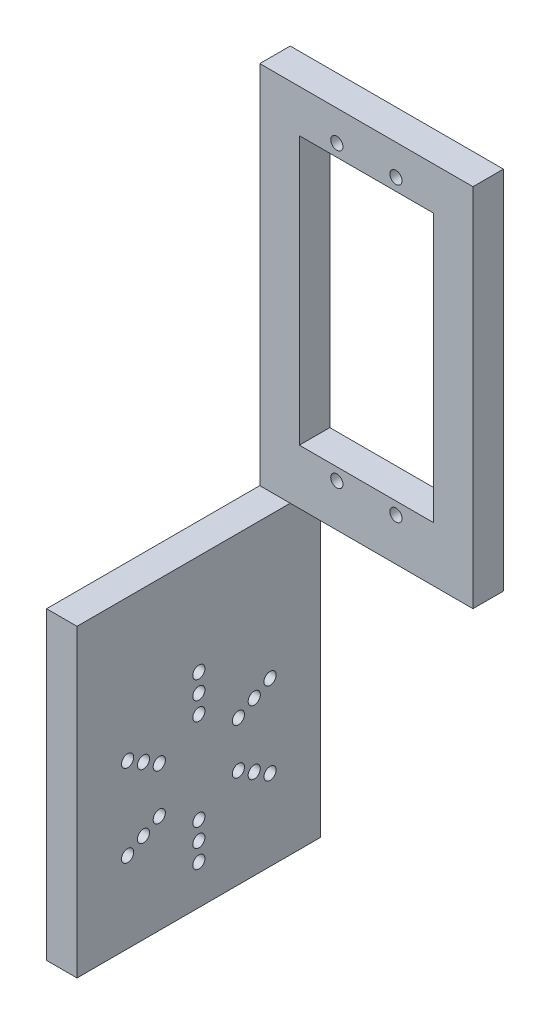
ISO-10303-21;
HEADER;
FILE_DESCRIPTION(('STEP AP214'),'2;1');
FILE_NAME('part.step','',(''),(''),'','','');
FILE_SCHEMA(('AUTOMOTIVE_DESIGN { 1 0 10303 214 1 1 1 1 }'));
ENDSEC;
DATA;
#1=APPLICATION_CONTEXT('core data for automotive mechanical design processes');
#2=APPLICATION_PROTOCOL_DEFINITION('international standard','automotive_design',2000,#1);
#3=PRODUCT_CONTEXT('',#1,'mechanical');
#4=PRODUCT('Part','Part','',(#3));
#5=PRODUCT_RELATED_PRODUCT_CATEGORY('part','',(#4));
#6=PRODUCT_DEFINITION_FORMATION('','',#4);
#7=PRODUCT_DEFINITION_CONTEXT('part definition',#1,'design');
#8=PRODUCT_DEFINITION('design','',#6,#7);
#9=PRODUCT_DEFINITION_SHAPE('','',#8);
#10=(LENGTH_UNIT() NAMED_UNIT(*) SI_UNIT(.MILLI.,.METRE.));
#11=(NAMED_UNIT(*) PLANE_ANGLE_UNIT() SI_UNIT($,.RADIAN.));
#12=(NAMED_UNIT(*) SI_UNIT($,.STERADIAN.) SOLID_ANGLE_UNIT());
#13=UNCERTAINTY_MEASURE_WITH_UNIT(LENGTH_MEASURE(1.E-05),#10,'distance_accuracy_value','');
#14=(GEOMETRIC_REPRESENTATION_CONTEXT(3) GLOBAL_UNCERTAINTY_ASSIGNED_CONTEXT((#13)) GLOBAL_UNIT_ASSIGNED_CONTEXT((#10,
#11,#12)) REPRESENTATION_CONTEXT('',''));
#15=CARTESIAN_POINT('',(0.,0.,0.));
#16=DIRECTION('',(0.,0.,1.));
#17=DIRECTION('',(1.,0.,0.));
#18=AXIS2_PLACEMENT_3D('',#15,#16,#17);
#19=CARTESIAN_POINT('',(0.,0.,5.));
#20=DIRECTION('',(0.,0.,1.));
#21=DIRECTION('',(1.,0.,0.));
#22=AXIS2_PLACEMENT_3D('',#19,#20,#21);
#23=PLANE('',#22);
#24=CARTESIAN_POINT('',(4.85,24.,5.));
#25=DIRECTION('',(0.,0.,1.));
#26=DIRECTION('',(1.,0.,0.));
#27=AXIS2_PLACEMENT_3D('',#24,#25,#26);
#28=CIRCLE('',#27,1.);
#29=CARTESIAN_POINT('',(5.85,24.,5.));
#30=VERTEX_POINT('',#29);
#31=EDGE_CURVE('E167',#30,#30,#28,.T.);
#32=ORIENTED_EDGE('',*,*,#31,.F.);
#33=EDGE_LOOP('',(#32));
#34=FACE_BOUND('',#33,.T.);
#35=CARTESIAN_POINT('',(-4.85,-24.,5.));
#36=DIRECTION('',(0.,0.,1.));
#37=DIRECTION('',(1.,0.,0.));
#38=AXIS2_PLACEMENT_3D('',#35,#36,#37);
#39=CIRCLE('',#38,1.);
#40=CARTESIAN_POINT('',(-3.85,-24.,5.));
#41=VERTEX_POINT('',#40);
#42=EDGE_CURVE('E183',#41,#41,#39,.T.);
#43=ORIENTED_EDGE('',*,*,#42,.F.);
#44=EDGE_LOOP('',(#43));
#45=FACE_BOUND('',#44,.T.);
#46=DIRECTION('',(0.,-1.,0.));
#47=VECTOR('',#46,1.);
#48=CARTESIAN_POINT('',(-17.5,29.,5.));
#49=LINE('',#48,#47);
#50=CARTESIAN_POINT('',(-17.5,29.,5.));
#51=VERTEX_POINT('',#50);
#52=CARTESIAN_POINT('',(-17.5,-31.,5.));
#53=VERTEX_POINT('',#52);
#54=EDGE_CURVE('E231',#51,#53,#49,.T.);
#55=ORIENTED_EDGE('',*,*,#54,.T.);
#56=DIRECTION('',(1.,0.,0.));
#57=VECTOR('',#56,1.);
#58=CARTESIAN_POINT('',(-17.5,-31.,5.));
#59=LINE('',#58,#57);
#60=CARTESIAN_POINT('',(-12.5,-31.,5.));
#61=VERTEX_POINT('',#60);
#62=EDGE_CURVE('E237',#53,#61,#59,.T.);
#63=ORIENTED_EDGE('',*,*,#62,.T.);
#64=CARTESIAN_POINT('',(17.5,-31.,5.));
#65=VERTEX_POINT('',#64);
#66=EDGE_CURVE('E235',#61,#65,#59,.T.);
#67=ORIENTED_EDGE('',*,*,#66,.T.);
#68=DIRECTION('',(0.,1.,0.));
#69=VECTOR('',#68,1.);
#70=CARTESIAN_POINT('',(17.5,29.,5.));
#71=LINE('',#70,#69);
#72=CARTESIAN_POINT('',(17.5,29.,5.));
#73=VERTEX_POINT('',#72);
#74=EDGE_CURVE('E241',#65,#73,#71,.T.);
#75=ORIENTED_EDGE('',*,*,#74,.T.);
#76=DIRECTION('',(-1.,0.,0.));
#77=VECTOR('',#76,1.);
#78=CARTESIAN_POINT('',(-17.5,29.,5.));
#79=LINE('',#78,#77);
#80=EDGE_CURVE('E244',#73,#51,#79,.T.);
#81=ORIENTED_EDGE('',*,*,#80,.T.);
#82=EDGE_LOOP('',(#55,#63,#67,#75,#81));
#83=FACE_BOUND('',#82,.T.);
#84=DIRECTION('',(1.,0.,0.));
#85=VECTOR('',#84,1.);
#86=CARTESIAN_POINT('',(-11.,-22.,5.));
#87=LINE('',#86,#85);
#88=CARTESIAN_POINT('',(-11.,-22.,5.));
#89=VERTEX_POINT('',#88);
#90=CARTESIAN_POINT('',(11.,-22.,5.));
#91=VERTEX_POINT('',#90);
#92=EDGE_CURVE('E194',#89,#91,#87,.T.);
#93=ORIENTED_EDGE('',*,*,#92,.F.);
#94=DIRECTION('',(0.,-1.,0.));
#95=VECTOR('',#94,1.);
#96=CARTESIAN_POINT('',(-11.,22.,5.));
#97=LINE('',#96,#95);
#98=CARTESIAN_POINT('',(-11.,22.,5.));
#99=VERTEX_POINT('',#98);
#100=EDGE_CURVE('E191',#99,#89,#97,.T.);
#101=ORIENTED_EDGE('',*,*,#100,.F.);
#102=DIRECTION('',(-1.,0.,0.));
#103=VECTOR('',#102,1.);
#104=CARTESIAN_POINT('',(-11.,22.,5.));
#105=LINE('',#104,#103);
#106=CARTESIAN_POINT('',(11.,22.,5.));
#107=VERTEX_POINT('',#106);
#108=EDGE_CURVE('E201',#107,#99,#105,.T.);
#109=ORIENTED_EDGE('',*,*,#108,.F.);
#110=DIRECTION('',(0.,1.,0.));
#111=VECTOR('',#110,1.);
#112=CARTESIAN_POINT('',(11.,22.,5.));
#113=LINE('',#112,#111);
#114=EDGE_CURVE('E198',#91,#107,#113,.T.);
#115=ORIENTED_EDGE('',*,*,#114,.F.);
#116=EDGE_LOOP('',(#93,#101,#109,#115));
#117=FACE_BOUND('',#116,.T.);
#118=CARTESIAN_POINT('',(4.85,-24.,5.));
#119=DIRECTION('',(0.,0.,1.));
#120=DIRECTION('',(1.,0.,0.));
#121=AXIS2_PLACEMENT_3D('',#118,#119,#120);
#122=CIRCLE('',#121,1.);
#123=CARTESIAN_POINT('',(5.85,-24.,5.));
#124=VERTEX_POINT('',#123);
#125=EDGE_CURVE('E175',#124,#124,#122,.T.);
#126=ORIENTED_EDGE('',*,*,#125,.F.);
#127=EDGE_LOOP('',(#126));
#128=FACE_BOUND('',#127,.T.);
#129=CARTESIAN_POINT('',(-4.85,24.,5.));
#130=DIRECTION('',(0.,0.,1.));
#131=DIRECTION('',(1.,0.,0.));
#132=AXIS2_PLACEMENT_3D('',#129,#130,#131);
#133=CIRCLE('',#132,1.);
#134=CARTESIAN_POINT('',(-3.85,24.,5.));
#135=VERTEX_POINT('',#134);
#136=EDGE_CURVE('E159',#135,#135,#133,.T.);
#137=ORIENTED_EDGE('',*,*,#136,.F.);
#138=EDGE_LOOP('',(#137));
#139=FACE_BOUND('',#138,.T.);
#140=ADVANCED_FACE('F39',(#34,#45,#83,#117,#128,#139),#23,.T.);
#141=CARTESIAN_POINT('',(0.,0.,0.));
#142=DIRECTION('',(0.,0.,1.));
#143=DIRECTION('',(1.,0.,0.));
#144=AXIS2_PLACEMENT_3D('',#141,#142,#143);
#145=PLANE('',#144);
#146=DIRECTION('',(0.,-1.,0.));
#147=VECTOR('',#146,1.);
#148=CARTESIAN_POINT('',(-17.5,29.,0.));
#149=LINE('',#148,#147);
#150=CARTESIAN_POINT('',(-17.5,29.,0.));
#151=VERTEX_POINT('',#150);
#152=CARTESIAN_POINT('',(-17.5,-81.,0.));
#153=VERTEX_POINT('',#152);
#154=EDGE_CURVE('E151',#151,#153,#149,.T.);
#155=ORIENTED_EDGE('',*,*,#154,.F.);
#156=DIRECTION('',(-1.,0.,0.));
#157=VECTOR('',#156,1.);
#158=CARTESIAN_POINT('',(-17.5,29.,0.));
#159=LINE('',#158,#157);
#160=CARTESIAN_POINT('',(17.5,29.,0.));
#161=VERTEX_POINT('',#160);
#162=EDGE_CURVE('E236',#161,#151,#159,.T.);
#163=ORIENTED_EDGE('',*,*,#162,.F.);
#164=DIRECTION('',(0.,1.,0.));
#165=VECTOR('',#164,1.);
#166=CARTESIAN_POINT('',(17.5,29.,0.));
#167=LINE('',#166,#165);
#168=CARTESIAN_POINT('',(17.5,-31.,0.));
#169=VERTEX_POINT('',#168);
#170=EDGE_CURVE('E253',#169,#161,#167,.T.);
#171=ORIENTED_EDGE('',*,*,#170,.F.);
#172=DIRECTION('',(1.,0.,0.));
#173=VECTOR('',#172,1.);
#174=CARTESIAN_POINT('',(-17.5,-31.,0.));
#175=LINE('',#174,#173);
#176=CARTESIAN_POINT('',(-12.5,-31.,0.));
#177=VERTEX_POINT('',#176);
#178=EDGE_CURVE('E250',#177,#169,#175,.T.);
#179=ORIENTED_EDGE('',*,*,#178,.F.);
#180=DIRECTION('',(0.,1.,0.));
#181=VECTOR('',#180,1.);
#182=CARTESIAN_POINT('',(-12.5,-31.,0.));
#183=LINE('',#182,#181);
#184=CARTESIAN_POINT('',(-12.5,-81.,0.));
#185=VERTEX_POINT('',#184);
#186=EDGE_CURVE('E57',#185,#177,#183,.T.);
#187=ORIENTED_EDGE('',*,*,#186,.F.);
#188=DIRECTION('',(1.,0.,0.));
#189=VECTOR('',#188,1.);
#190=CARTESIAN_POINT('',(-17.5,-81.,0.));
#191=LINE('',#190,#189);
#192=EDGE_CURVE('E298',#153,#185,#191,.T.);
#193=ORIENTED_EDGE('',*,*,#192,.F.);
#194=EDGE_LOOP('',(#155,#163,#171,#179,#187,#193));
#195=FACE_BOUND('',#194,.T.);
#196=DIRECTION('',(0.,-1.,0.));
#197=VECTOR('',#196,1.);
#198=CARTESIAN_POINT('',(-11.,22.,0.));
#199=LINE('',#198,#197);
#200=CARTESIAN_POINT('',(-11.,22.,0.));
#201=VERTEX_POINT('',#200);
#202=CARTESIAN_POINT('',(-11.,-22.,0.));
#203=VERTEX_POINT('',#202);
#204=EDGE_CURVE('E187',#201,#203,#199,.T.);
#205=ORIENTED_EDGE('',*,*,#204,.T.);
#206=DIRECTION('',(1.,0.,0.));
#207=VECTOR('',#206,1.);
#208=CARTESIAN_POINT('',(-11.,-22.,0.));
#209=LINE('',#208,#207);
#210=CARTESIAN_POINT('',(11.,-22.,0.));
#211=VERTEX_POINT('',#210);
#212=EDGE_CURVE('E208',#203,#211,#209,.T.);
#213=ORIENTED_EDGE('',*,*,#212,.T.);
#214=DIRECTION('',(0.,1.,0.));
#215=VECTOR('',#214,1.);
#216=CARTESIAN_POINT('',(11.,22.,0.));
#217=LINE('',#216,#215);
#218=CARTESIAN_POINT('',(11.,22.,0.));
#219=VERTEX_POINT('',#218);
#220=EDGE_CURVE('E212',#211,#219,#217,.T.);
#221=ORIENTED_EDGE('',*,*,#220,.T.);
#222=DIRECTION('',(-1.,0.,0.));
#223=VECTOR('',#222,1.);
#224=CARTESIAN_POINT('',(-11.,22.,0.));
#225=LINE('',#224,#223);
#226=EDGE_CURVE('E195',#219,#201,#225,.T.);
#227=ORIENTED_EDGE('',*,*,#226,.T.);
#228=EDGE_LOOP('',(#205,#213,#221,#227));
#229=FACE_BOUND('',#228,.T.);
#230=CARTESIAN_POINT('',(-4.85,-24.,0.));
#231=DIRECTION('',(0.,0.,1.));
#232=DIRECTION('',(1.,0.,0.));
#233=AXIS2_PLACEMENT_3D('',#230,#231,#232);
#234=CIRCLE('',#233,1.);
#235=CARTESIAN_POINT('',(-3.85,-24.,0.));
#236=VERTEX_POINT('',#235);
#237=EDGE_CURVE('E179',#236,#236,#234,.T.);
#238=ORIENTED_EDGE('',*,*,#237,.T.);
#239=EDGE_LOOP('',(#238));
#240=FACE_BOUND('',#239,.T.);
#241=CARTESIAN_POINT('',(4.85,-24.,0.));
#242=DIRECTION('',(0.,0.,1.));
#243=DIRECTION('',(1.,0.,0.));
#244=AXIS2_PLACEMENT_3D('',#241,#242,#243);
#245=CIRCLE('',#244,1.);
#246=CARTESIAN_POINT('',(5.85,-24.,0.));
#247=VERTEX_POINT('',#246);
#248=EDGE_CURVE('E171',#247,#247,#245,.T.);
#249=ORIENTED_EDGE('',*,*,#248,.T.);
#250=EDGE_LOOP('',(#249));
#251=FACE_BOUND('',#250,.T.);
#252=CARTESIAN_POINT('',(4.85,24.,0.));
#253=DIRECTION('',(0.,0.,1.));
#254=DIRECTION('',(1.,0.,0.));
#255=AXIS2_PLACEMENT_3D('',#252,#253,#254);
#256=CIRCLE('',#255,1.);
#257=CARTESIAN_POINT('',(5.85,24.,0.));
#258=VERTEX_POINT('',#257);
#259=EDGE_CURVE('E165',#258,#258,#256,.T.);
#260=ORIENTED_EDGE('',*,*,#259,.T.);
#261=EDGE_LOOP('',(#260));
#262=FACE_BOUND('',#261,.T.);
#263=CARTESIAN_POINT('',(-4.85,24.,0.));
#264=DIRECTION('',(0.,0.,1.));
#265=DIRECTION('',(1.,0.,0.));
#266=AXIS2_PLACEMENT_3D('',#263,#264,#265);
#267=CIRCLE('',#266,1.);
#268=CARTESIAN_POINT('',(-3.85,24.,0.));
#269=VERTEX_POINT('',#268);
#270=EDGE_CURVE('E154',#269,#269,#267,.T.);
#271=ORIENTED_EDGE('',*,*,#270,.T.);
#272=EDGE_LOOP('',(#271));
#273=FACE_BOUND('',#272,.T.);
#274=ADVANCED_FACE('F277',(#195,#229,#240,#251,#262,#273),#145,.F.);
#275=CARTESIAN_POINT('',(-17.5,29.,5.));
#276=DIRECTION('',(1.,0.,0.));
#277=DIRECTION('',(0.,1.,0.));
#278=AXIS2_PLACEMENT_3D('',#275,#276,#277);
#279=PLANE('',#278);
#280=CARTESIAN_POINT('',(-17.5,-74.5,20.));
#281=DIRECTION('',(1.,0.,0.));
#282=DIRECTION('',(0.,1.,0.));
#283=AXIS2_PLACEMENT_3D('',#280,#281,#282);
#284=CIRCLE('',#283,1.);
#285=CARTESIAN_POINT('',(-17.5,-73.5,20.));
#286=VERTEX_POINT('',#285);
#287=EDGE_CURVE('E301',#286,#286,#284,.F.);
#288=ORIENTED_EDGE('',*,*,#287,.F.);
#289=EDGE_LOOP('',(#288));
#290=FACE_BOUND('',#289,.T.);
#291=CARTESIAN_POINT('',(-17.5,-64.75,13.5048094716167));
#292=DIRECTION('',(1.,0.,0.));
#293=DIRECTION('',(0.,1.,0.));
#294=AXIS2_PLACEMENT_3D('',#291,#292,#293);
#295=CIRCLE('',#294,1.);
#296=CARTESIAN_POINT('',(-17.5,-63.75,13.5048094716167));
#297=VERTEX_POINT('',#296);
#298=EDGE_CURVE('E381',#297,#297,#295,.F.);
#299=ORIENTED_EDGE('',*,*,#298,.F.);
#300=EDGE_LOOP('',(#299));
#301=FACE_BOUND('',#300,.T.);
#302=CARTESIAN_POINT('',(-17.5,-55.75,29.0932667397366));
#303=DIRECTION('',(1.,0.,0.));
#304=DIRECTION('',(0.,1.,0.));
#305=AXIS2_PLACEMENT_3D('',#302,#303,#304);
#306=CIRCLE('',#305,1.);
#307=CARTESIAN_POINT('',(-17.5,-54.75,29.0932667397366));
#308=VERTEX_POINT('',#307);
#309=EDGE_CURVE('E340',#308,#308,#306,.F.);
#310=ORIENTED_EDGE('',*,*,#309,.F.);
#311=EDGE_LOOP('',(#310));
#312=FACE_BOUND('',#311,.T.);
#313=CARTESIAN_POINT('',(-17.5,-54.25,31.6913429510899));
#314=DIRECTION('',(1.,0.,0.));
#315=DIRECTION('',(0.,1.,0.));
#316=AXIS2_PLACEMENT_3D('',#313,#314,#315);
#317=CIRCLE('',#316,1.00000000000001);
#318=CARTESIAN_POINT('',(-17.5,-53.25,31.6913429510899));
#319=VERTEX_POINT('',#318);
#320=EDGE_CURVE('E350',#319,#319,#317,.F.);
#321=ORIENTED_EDGE('',*,*,#320,.F.);
#322=EDGE_LOOP('',(#321));
#323=FACE_BOUND('',#322,.T.);
#324=CARTESIAN_POINT('',(-17.5,-64.75,26.4951905283833));
#325=DIRECTION('',(1.,0.,0.));
#326=DIRECTION('',(0.,1.,0.));
#327=AXIS2_PLACEMENT_3D('',#324,#325,#326);
#328=CIRCLE('',#327,1.00000000000001);
#329=CARTESIAN_POINT('',(-17.5,-63.75,26.4951905283833));
#330=VERTEX_POINT('',#329);
#331=EDGE_CURVE('E358',#330,#330,#328,.F.);
#332=ORIENTED_EDGE('',*,*,#331,.F.);
#333=EDGE_LOOP('',(#332));
#334=FACE_BOUND('',#333,.T.);
#335=CARTESIAN_POINT('',(-17.5,-66.25,29.0932667397366));
#336=DIRECTION('',(1.,0.,0.));
#337=DIRECTION('',(0.,1.,0.));
#338=AXIS2_PLACEMENT_3D('',#335,#336,#337);
#339=CIRCLE('',#338,1.00000000000001);
#340=CARTESIAN_POINT('',(-17.5,-65.25,29.0932667397366));
#341=VERTEX_POINT('',#340);
#342=EDGE_CURVE('E333',#341,#341,#339,.F.);
#343=ORIENTED_EDGE('',*,*,#342,.F.);
#344=EDGE_LOOP('',(#343));
#345=FACE_BOUND('',#344,.T.);
#346=CARTESIAN_POINT('',(-17.5,-71.5,20.));
#347=DIRECTION('',(1.,0.,0.));
#348=DIRECTION('',(0.,1.,0.));
#349=AXIS2_PLACEMENT_3D('',#346,#347,#348);
#350=CIRCLE('',#349,1.);
#351=CARTESIAN_POINT('',(-17.5,-70.5,20.));
#352=VERTEX_POINT('',#351);
#353=EDGE_CURVE('E316',#352,#352,#350,.F.);
#354=ORIENTED_EDGE('',*,*,#353,.F.);
#355=EDGE_LOOP('',(#354));
#356=FACE_BOUND('',#355,.T.);
#357=CARTESIAN_POINT('',(-17.5,-68.5,20.));
#358=DIRECTION('',(1.,0.,0.));
#359=DIRECTION('',(0.,1.,0.));
#360=AXIS2_PLACEMENT_3D('',#357,#358,#359);
#361=CIRCLE('',#360,1.);
#362=CARTESIAN_POINT('',(-17.5,-67.5,20.));
#363=VERTEX_POINT('',#362);
#364=EDGE_CURVE('E306',#363,#363,#361,.F.);
#365=ORIENTED_EDGE('',*,*,#364,.F.);
#366=EDGE_LOOP('',(#365));
#367=FACE_BOUND('',#366,.T.);
#368=CARTESIAN_POINT('',(-17.5,-54.25,8.3086570489101));
#369=DIRECTION('',(1.,0.,0.));
#370=DIRECTION('',(0.,1.,0.));
#371=AXIS2_PLACEMENT_3D('',#368,#369,#370);
#372=CIRCLE('',#371,0.999999999999998);
#373=CARTESIAN_POINT('',(-17.5,-53.25,8.3086570489101));
#374=VERTEX_POINT('',#373);
#375=EDGE_CURVE('E315',#374,#374,#372,.F.);
#376=ORIENTED_EDGE('',*,*,#375,.F.);
#377=EDGE_LOOP('',(#376));
#378=FACE_BOUND('',#377,.T.);
#379=CARTESIAN_POINT('',(-17.5,-67.75,31.6913429510899));
#380=DIRECTION('',(1.,0.,0.));
#381=DIRECTION('',(0.,1.,0.));
#382=AXIS2_PLACEMENT_3D('',#379,#380,#381);
#383=CIRCLE('',#382,0.999999999999985);
#384=CARTESIAN_POINT('',(-17.5,-66.75,31.6913429510899));
#385=VERTEX_POINT('',#384);
#386=EDGE_CURVE('E324',#385,#385,#383,.F.);
#387=ORIENTED_EDGE('',*,*,#386,.F.);
#388=EDGE_LOOP('',(#387));
#389=FACE_BOUND('',#388,.T.);
#390=CARTESIAN_POINT('',(-17.5,-53.5,20.));
#391=DIRECTION('',(1.,0.,0.));
#392=DIRECTION('',(0.,1.,0.));
#393=AXIS2_PLACEMENT_3D('',#390,#391,#392);
#394=CIRCLE('',#393,1.00000000000001);
#395=CARTESIAN_POINT('',(-17.5,-52.5,20.));
#396=VERTEX_POINT('',#395);
#397=EDGE_CURVE('E422',#396,#396,#394,.F.);
#398=ORIENTED_EDGE('',*,*,#397,.F.);
#399=EDGE_LOOP('',(#398));
#400=FACE_BOUND('',#399,.T.);
#401=CARTESIAN_POINT('',(-17.5,-50.5,20.));
#402=DIRECTION('',(1.,0.,0.));
#403=DIRECTION('',(0.,1.,0.));
#404=AXIS2_PLACEMENT_3D('',#401,#402,#403);
#405=CIRCLE('',#404,1.00000000000001);
#406=CARTESIAN_POINT('',(-17.5,-49.5,20.));
#407=VERTEX_POINT('',#406);
#408=EDGE_CURVE('E415',#407,#407,#405,.F.);
#409=ORIENTED_EDGE('',*,*,#408,.F.);
#410=EDGE_LOOP('',(#409));
#411=FACE_BOUND('',#410,.T.);
#412=CARTESIAN_POINT('',(-17.5,-47.5,20.));
#413=DIRECTION('',(1.,0.,0.));
#414=DIRECTION('',(0.,1.,0.));
#415=AXIS2_PLACEMENT_3D('',#412,#413,#414);
#416=CIRCLE('',#415,1.00000000000001);
#417=CARTESIAN_POINT('',(-17.5,-46.5,20.));
#418=VERTEX_POINT('',#417);
#419=EDGE_CURVE('E406',#418,#418,#416,.F.);
#420=ORIENTED_EDGE('',*,*,#419,.F.);
#421=EDGE_LOOP('',(#420));
#422=FACE_BOUND('',#421,.T.);
#423=CARTESIAN_POINT('',(-17.5,-57.25,26.4951905283833));
#424=DIRECTION('',(1.,0.,0.));
#425=DIRECTION('',(0.,1.,0.));
#426=AXIS2_PLACEMENT_3D('',#423,#424,#425);
#427=CIRCLE('',#426,1.);
#428=CARTESIAN_POINT('',(-17.5,-56.25,26.4951905283833));
#429=VERTEX_POINT('',#428);
#430=EDGE_CURVE('E349',#429,#429,#427,.F.);
#431=ORIENTED_EDGE('',*,*,#430,.F.);
#432=EDGE_LOOP('',(#431));
#433=FACE_BOUND('',#432,.T.);
#434=CARTESIAN_POINT('',(-17.5,-55.75,10.9067332602634));
#435=DIRECTION('',(1.,0.,0.));
#436=DIRECTION('',(0.,1.,0.));
#437=AXIS2_PLACEMENT_3D('',#434,#435,#436);
#438=CIRCLE('',#437,1.00000000000001);
#439=CARTESIAN_POINT('',(-17.5,-54.75,10.9067332602634));
#440=VERTEX_POINT('',#439);
#441=EDGE_CURVE('E398',#440,#440,#438,.F.);
#442=ORIENTED_EDGE('',*,*,#441,.F.);
#443=EDGE_LOOP('',(#442));
#444=FACE_BOUND('',#443,.T.);
#445=CARTESIAN_POINT('',(-17.5,-57.25,13.5048094716167));
#446=DIRECTION('',(1.,0.,0.));
#447=DIRECTION('',(0.,1.,0.));
#448=AXIS2_PLACEMENT_3D('',#445,#446,#447);
#449=CIRCLE('',#448,0.999999999999998);
#450=CARTESIAN_POINT('',(-17.5,-56.25,13.5048094716167));
#451=VERTEX_POINT('',#450);
#452=EDGE_CURVE('E390',#451,#451,#449,.F.);
#453=ORIENTED_EDGE('',*,*,#452,.F.);
#454=EDGE_LOOP('',(#453));
#455=FACE_BOUND('',#454,.T.);
#456=CARTESIAN_POINT('',(-17.5,-67.7499999999999,8.30865704891007));
#457=DIRECTION('',(1.,0.,0.));
#458=DIRECTION('',(0.,1.,0.));
#459=AXIS2_PLACEMENT_3D('',#456,#457,#458);
#460=CIRCLE('',#459,1.);
#461=CARTESIAN_POINT('',(-17.5,-66.7499999999999,8.30865704891007));
#462=VERTEX_POINT('',#461);
#463=EDGE_CURVE('E382',#462,#462,#460,.F.);
#464=ORIENTED_EDGE('',*,*,#463,.F.);
#465=EDGE_LOOP('',(#464));
#466=FACE_BOUND('',#465,.T.);
#467=CARTESIAN_POINT('',(-17.5,-66.2499999999999,10.9067332602634));
#468=DIRECTION('',(1.,0.,0.));
#469=DIRECTION('',(0.,1.,0.));
#470=AXIS2_PLACEMENT_3D('',#467,#468,#469);
#471=CIRCLE('',#470,1.);
#472=CARTESIAN_POINT('',(-17.5,-65.2499999999999,10.9067332602634));
#473=VERTEX_POINT('',#472);
#474=EDGE_CURVE('E372',#473,#473,#471,.F.);
#475=ORIENTED_EDGE('',*,*,#474,.F.);
#476=EDGE_LOOP('',(#475));
#477=FACE_BOUND('',#476,.T.);
#478=ORIENTED_EDGE('',*,*,#154,.T.);
#479=DIRECTION('',(0.,0.,-1.));
#480=VECTOR('',#479,1.);
#481=CARTESIAN_POINT('',(-17.5,-81.,40.));
#482=LINE('',#481,#480);
#483=CARTESIAN_POINT('',(-17.5,-81.,40.));
#484=VERTEX_POINT('',#483);
#485=EDGE_CURVE('E132',#484,#153,#482,.T.);
#486=ORIENTED_EDGE('',*,*,#485,.F.);
#487=DIRECTION('',(0.,-1.,0.));
#488=VECTOR('',#487,1.);
#489=CARTESIAN_POINT('',(-17.5,-31.,40.));
#490=LINE('',#489,#488);
#491=CARTESIAN_POINT('',(-17.5,-31.,40.));
#492=VERTEX_POINT('',#491);
#493=EDGE_CURVE('E138',#492,#484,#490,.T.);
#494=ORIENTED_EDGE('',*,*,#493,.F.);
#495=DIRECTION('',(0.,0.,-1.));
#496=VECTOR('',#495,1.);
#497=CARTESIAN_POINT('',(-17.5,-31.,40.));
#498=LINE('',#497,#496);
#499=EDGE_CURVE('E282',#492,#53,#498,.T.);
#500=ORIENTED_EDGE('',*,*,#499,.T.);
#501=ORIENTED_EDGE('',*,*,#54,.F.);
#502=DIRECTION('',(0.,0.,-1.));
#503=VECTOR('',#502,1.);
#504=CARTESIAN_POINT('',(-17.5,29.,5.));
#505=LINE('',#504,#503);
#506=EDGE_CURVE('E247',#51,#151,#505,.T.);
#507=ORIENTED_EDGE('',*,*,#506,.T.);
#508=EDGE_LOOP('',(#478,#486,#494,#500,#501,#507));
#509=FACE_BOUND('',#508,.T.);
#510=ADVANCED_FACE('F41',(#290,#301,#312,#323,#334,#345,#356,#367,#378,#389,#400,#411,#422,#433,
#444,#455,#466,#477,#509),#279,.F.);
#511=CARTESIAN_POINT('',(-17.5,-31.,5.));
#512=DIRECTION('',(0.,1.,0.));
#513=DIRECTION('',(0.,0.,1.));
#514=AXIS2_PLACEMENT_3D('',#511,#512,#513);
#515=PLANE('',#514);
#516=ORIENTED_EDGE('',*,*,#66,.F.);
#517=DIRECTION('',(0.,0.,-1.));
#518=VECTOR('',#517,1.);
#519=CARTESIAN_POINT('',(-12.5,-31.,40.));
#520=LINE('',#519,#518);
#521=EDGE_CURVE('E11',#61,#177,#520,.T.);
#522=ORIENTED_EDGE('',*,*,#521,.T.);
#523=ORIENTED_EDGE('',*,*,#178,.T.);
#524=DIRECTION('',(0.,0.,-1.));
#525=VECTOR('',#524,1.);
#526=CARTESIAN_POINT('',(17.5,-31.,5.));
#527=LINE('',#526,#525);
#528=EDGE_CURVE('E43',#65,#169,#527,.T.);
#529=ORIENTED_EDGE('',*,*,#528,.F.);
#530=EDGE_LOOP('',(#516,#522,#523,#529));
#531=FACE_BOUND('',#530,.T.);
#532=ADVANCED_FACE('F286',(#531),#515,.F.);
#533=CARTESIAN_POINT('',(17.5,29.,5.));
#534=DIRECTION('',(-1.,0.,0.));
#535=DIRECTION('',(0.,-1.,0.));
#536=AXIS2_PLACEMENT_3D('',#533,#534,#535);
#537=PLANE('',#536);
#538=ORIENTED_EDGE('',*,*,#170,.T.);
#539=DIRECTION('',(0.,0.,-1.));
#540=VECTOR('',#539,1.);
#541=CARTESIAN_POINT('',(17.5,29.,5.));
#542=LINE('',#541,#540);
#543=EDGE_CURVE('E259',#73,#161,#542,.T.);
#544=ORIENTED_EDGE('',*,*,#543,.F.);
#545=ORIENTED_EDGE('',*,*,#74,.F.);
#546=ORIENTED_EDGE('',*,*,#528,.T.);
#547=EDGE_LOOP('',(#538,#544,#545,#546));
#548=FACE_BOUND('',#547,.T.);
#549=ADVANCED_FACE('F272',(#548),#537,.F.);
#550=CARTESIAN_POINT('',(-17.5,29.,5.));
#551=DIRECTION('',(0.,-1.,0.));
#552=DIRECTION('',(0.,0.,-1.));
#553=AXIS2_PLACEMENT_3D('',#550,#551,#552);
#554=PLANE('',#553);
#555=ORIENTED_EDGE('',*,*,#162,.T.);
#556=ORIENTED_EDGE('',*,*,#506,.F.);
#557=ORIENTED_EDGE('',*,*,#80,.F.);
#558=ORIENTED_EDGE('',*,*,#543,.T.);
#559=EDGE_LOOP('',(#555,#556,#557,#558));
#560=FACE_BOUND('',#559,.T.);
#561=ADVANCED_FACE('F280',(#560),#554,.F.);
#562=CARTESIAN_POINT('',(-11.,22.,5.));
#563=DIRECTION('',(1.,0.,0.));
#564=DIRECTION('',(0.,0.,-1.));
#565=AXIS2_PLACEMENT_3D('',#562,#563,#564);
#566=PLANE('',#565);
#567=ORIENTED_EDGE('',*,*,#204,.F.);
#568=DIRECTION('',(0.,0.,-1.));
#569=VECTOR('',#568,1.);
#570=CARTESIAN_POINT('',(-11.,22.,5.));
#571=LINE('',#570,#569);
#572=EDGE_CURVE('E204',#99,#201,#571,.T.);
#573=ORIENTED_EDGE('',*,*,#572,.F.);
#574=ORIENTED_EDGE('',*,*,#100,.T.);
#575=DIRECTION('',(0.,0.,-1.));
#576=VECTOR('',#575,1.);
#577=CARTESIAN_POINT('',(-11.,-22.,5.));
#578=LINE('',#577,#576);
#579=EDGE_CURVE('E227',#89,#203,#578,.T.);
#580=ORIENTED_EDGE('',*,*,#579,.T.);
#581=EDGE_LOOP('',(#567,#573,#574,#580));
#582=FACE_BOUND('',#581,.T.);
#583=ADVANCED_FACE('F513',(#582),#566,.T.);
#584=CARTESIAN_POINT('',(-11.,-22.,5.));
#585=DIRECTION('',(0.,1.,0.));
#586=DIRECTION('',(0.,0.,1.));
#587=AXIS2_PLACEMENT_3D('',#584,#585,#586);
#588=PLANE('',#587);
#589=ORIENTED_EDGE('',*,*,#212,.F.);
#590=ORIENTED_EDGE('',*,*,#579,.F.);
#591=ORIENTED_EDGE('',*,*,#92,.T.);
#592=DIRECTION('',(0.,0.,-1.));
#593=VECTOR('',#592,1.);
#594=CARTESIAN_POINT('',(11.,-22.,5.));
#595=LINE('',#594,#593);
#596=EDGE_CURVE('E224',#91,#211,#595,.T.);
#597=ORIENTED_EDGE('',*,*,#596,.T.);
#598=EDGE_LOOP('',(#589,#590,#591,#597));
#599=FACE_BOUND('',#598,.T.);
#600=ADVANCED_FACE('F806',(#599),#588,.T.);
#601=CARTESIAN_POINT('',(11.,22.,5.));
#602=DIRECTION('',(-1.,0.,0.));
#603=DIRECTION('',(0.,0.,1.));
#604=AXIS2_PLACEMENT_3D('',#601,#602,#603);
#605=PLANE('',#604);
#606=ORIENTED_EDGE('',*,*,#220,.F.);
#607=ORIENTED_EDGE('',*,*,#596,.F.);
#608=ORIENTED_EDGE('',*,*,#114,.T.);
#609=DIRECTION('',(0.,0.,-1.));
#610=VECTOR('',#609,1.);
#611=CARTESIAN_POINT('',(11.,22.,5.));
#612=LINE('',#611,#610);
#613=EDGE_CURVE('E64',#107,#219,#612,.T.);
#614=ORIENTED_EDGE('',*,*,#613,.T.);
#615=EDGE_LOOP('',(#606,#607,#608,#614));
#616=FACE_BOUND('',#615,.T.);
#617=ADVANCED_FACE('F797',(#616),#605,.T.);
#618=CARTESIAN_POINT('',(-11.,22.,5.));
#619=DIRECTION('',(0.,-1.,0.));
#620=DIRECTION('',(0.,0.,-1.));
#621=AXIS2_PLACEMENT_3D('',#618,#619,#620);
#622=PLANE('',#621);
#623=ORIENTED_EDGE('',*,*,#226,.F.);
#624=ORIENTED_EDGE('',*,*,#613,.F.);
#625=ORIENTED_EDGE('',*,*,#108,.T.);
#626=ORIENTED_EDGE('',*,*,#572,.T.);
#627=EDGE_LOOP('',(#623,#624,#625,#626));
#628=FACE_BOUND('',#627,.T.);
#629=ADVANCED_FACE('F787',(#628),#622,.T.);
#630=CARTESIAN_POINT('',(-4.85,-24.,5.));
#631=DIRECTION('',(0.,0.,-1.));
#632=DIRECTION('',(-1.,0.,0.));
#633=AXIS2_PLACEMENT_3D('',#630,#631,#632);
#634=CYLINDRICAL_SURFACE('',#633,1.);
#635=ORIENTED_EDGE('',*,*,#42,.T.);
#636=EDGE_LOOP('',(#635));
#637=FACE_BOUND('',#636,.T.);
#638=ORIENTED_EDGE('',*,*,#237,.F.);
#639=EDGE_LOOP('',(#638));
#640=FACE_BOUND('',#639,.T.);
#641=ADVANCED_FACE('F777',(#637,#640),#634,.F.);
#642=CARTESIAN_POINT('',(4.85,-24.,5.));
#643=DIRECTION('',(0.,0.,-1.));
#644=DIRECTION('',(-1.,0.,0.));
#645=AXIS2_PLACEMENT_3D('',#642,#643,#644);
#646=CYLINDRICAL_SURFACE('',#645,1.);
#647=ORIENTED_EDGE('',*,*,#125,.T.);
#648=EDGE_LOOP('',(#647));
#649=FACE_BOUND('',#648,.T.);
#650=ORIENTED_EDGE('',*,*,#248,.F.);
#651=EDGE_LOOP('',(#650));
#652=FACE_BOUND('',#651,.T.);
#653=ADVANCED_FACE('F767',(#649,#652),#646,.F.);
#654=CARTESIAN_POINT('',(4.85,24.,5.));
#655=DIRECTION('',(0.,0.,-1.));
#656=DIRECTION('',(-1.,0.,0.));
#657=AXIS2_PLACEMENT_3D('',#654,#655,#656);
#658=CYLINDRICAL_SURFACE('',#657,1.);
#659=ORIENTED_EDGE('',*,*,#31,.T.);
#660=EDGE_LOOP('',(#659));
#661=FACE_BOUND('',#660,.T.);
#662=ORIENTED_EDGE('',*,*,#259,.F.);
#663=EDGE_LOOP('',(#662));
#664=FACE_BOUND('',#663,.T.);
#665=ADVANCED_FACE('F757',(#661,#664),#658,.F.);
#666=CARTESIAN_POINT('',(-4.85,24.,5.));
#667=DIRECTION('',(0.,0.,-1.));
#668=DIRECTION('',(-1.,0.,0.));
#669=AXIS2_PLACEMENT_3D('',#666,#667,#668);
#670=CYLINDRICAL_SURFACE('',#669,1.);
#671=ORIENTED_EDGE('',*,*,#136,.T.);
#672=EDGE_LOOP('',(#671));
#673=FACE_BOUND('',#672,.T.);
#674=ORIENTED_EDGE('',*,*,#270,.F.);
#675=EDGE_LOOP('',(#674));
#676=FACE_BOUND('',#675,.T.);
#677=ADVANCED_FACE('F732',(#673,#676),#670,.F.);
#678=CARTESIAN_POINT('',(-17.5,-81.,40.));
#679=DIRECTION('',(0.,1.,0.));
#680=DIRECTION('',(0.,0.,1.));
#681=AXIS2_PLACEMENT_3D('',#678,#679,#680);
#682=PLANE('',#681);
#683=ORIENTED_EDGE('',*,*,#192,.T.);
#684=DIRECTION('',(0.,0.,-1.));
#685=VECTOR('',#684,1.);
#686=CARTESIAN_POINT('',(-12.5,-81.,40.));
#687=LINE('',#686,#685);
#688=CARTESIAN_POINT('',(-12.5,-81.,40.));
#689=VERTEX_POINT('',#688);
#690=EDGE_CURVE('E133',#689,#185,#687,.T.);
#691=ORIENTED_EDGE('',*,*,#690,.F.);
#692=DIRECTION('',(1.,0.,0.));
#693=VECTOR('',#692,1.);
#694=CARTESIAN_POINT('',(-17.5,-81.,40.));
#695=LINE('',#694,#693);
#696=EDGE_CURVE('E128',#484,#689,#695,.T.);
#697=ORIENTED_EDGE('',*,*,#696,.F.);
#698=ORIENTED_EDGE('',*,*,#485,.T.);
#699=EDGE_LOOP('',(#683,#691,#697,#698));
#700=FACE_BOUND('',#699,.T.);
#701=ADVANCED_FACE('F130',(#700),#682,.F.);
#702=CARTESIAN_POINT('',(-12.5,-31.,40.));
#703=DIRECTION('',(-1.,0.,0.));
#704=DIRECTION('',(0.,-1.,0.));
#705=AXIS2_PLACEMENT_3D('',#702,#703,#704);
#706=PLANE('',#705);
#707=CARTESIAN_POINT('',(-12.5,-74.5,20.));
#708=DIRECTION('',(1.,0.,0.));
#709=DIRECTION('',(0.,1.,0.));
#710=AXIS2_PLACEMENT_3D('',#707,#708,#709);
#711=CIRCLE('',#710,1.);
#712=CARTESIAN_POINT('',(-12.5,-73.5,20.));
#713=VERTEX_POINT('',#712);
#714=EDGE_CURVE('E320',#713,#713,#711,.T.);
#715=ORIENTED_EDGE('',*,*,#714,.F.);
#716=EDGE_LOOP('',(#715));
#717=FACE_BOUND('',#716,.T.);
#718=CARTESIAN_POINT('',(-12.5,-64.75,13.5048094716167));
#719=DIRECTION('',(1.,0.,0.));
#720=DIRECTION('',(0.,1.,0.));
#721=AXIS2_PLACEMENT_3D('',#718,#719,#720);
#722=CIRCLE('',#721,1.);
#723=CARTESIAN_POINT('',(-12.5,-63.75,13.5048094716167));
#724=VERTEX_POINT('',#723);
#725=EDGE_CURVE('E439',#724,#724,#722,.T.);
#726=ORIENTED_EDGE('',*,*,#725,.F.);
#727=EDGE_LOOP('',(#726));
#728=FACE_BOUND('',#727,.T.);
#729=CARTESIAN_POINT('',(-12.5,-55.75,29.0932667397366));
#730=DIRECTION('',(1.,0.,0.));
#731=DIRECTION('',(0.,1.,0.));
#732=AXIS2_PLACEMENT_3D('',#729,#730,#731);
#733=CIRCLE('',#732,1.);
#734=CARTESIAN_POINT('',(-12.5,-54.75,29.0932667397366));
#735=VERTEX_POINT('',#734);
#736=EDGE_CURVE('E345',#735,#735,#733,.T.);
#737=ORIENTED_EDGE('',*,*,#736,.F.);
#738=EDGE_LOOP('',(#737));
#739=FACE_BOUND('',#738,.T.);
#740=CARTESIAN_POINT('',(-12.5,-54.25,31.6913429510899));
#741=DIRECTION('',(1.,0.,0.));
#742=DIRECTION('',(0.,1.,0.));
#743=AXIS2_PLACEMENT_3D('',#740,#741,#742);
#744=CIRCLE('',#743,1.00000000000001);
#745=CARTESIAN_POINT('',(-12.5,-53.25,31.6913429510899));
#746=VERTEX_POINT('',#745);
#747=EDGE_CURVE('E344',#746,#746,#744,.T.);
#748=ORIENTED_EDGE('',*,*,#747,.F.);
#749=EDGE_LOOP('',(#748));
#750=FACE_BOUND('',#749,.T.);
#751=CARTESIAN_POINT('',(-12.5,-64.75,26.4951905283833));
#752=DIRECTION('',(1.,0.,0.));
#753=DIRECTION('',(0.,1.,0.));
#754=AXIS2_PLACEMENT_3D('',#751,#752,#753);
#755=CIRCLE('',#754,1.00000000000001);
#756=CARTESIAN_POINT('',(-12.5,-63.75,26.4951905283833));
#757=VERTEX_POINT('',#756);
#758=EDGE_CURVE('E354',#757,#757,#755,.T.);
#759=ORIENTED_EDGE('',*,*,#758,.F.);
#760=EDGE_LOOP('',(#759));
#761=FACE_BOUND('',#760,.T.);
#762=CARTESIAN_POINT('',(-12.5,-66.25,29.0932667397366));
#763=DIRECTION('',(1.,0.,0.));
#764=DIRECTION('',(0.,1.,0.));
#765=AXIS2_PLACEMENT_3D('',#762,#763,#764);
#766=CIRCLE('',#765,1.00000000000001);
#767=CARTESIAN_POINT('',(-12.5,-65.25,29.0932667397366));
#768=VERTEX_POINT('',#767);
#769=EDGE_CURVE('E362',#768,#768,#766,.T.);
#770=ORIENTED_EDGE('',*,*,#769,.F.);
#771=EDGE_LOOP('',(#770));
#772=FACE_BOUND('',#771,.T.);
#773=CARTESIAN_POINT('',(-12.5,-71.5,20.));
#774=DIRECTION('',(1.,0.,0.));
#775=DIRECTION('',(0.,1.,0.));
#776=AXIS2_PLACEMENT_3D('',#773,#774,#775);
#777=CIRCLE('',#776,1.);
#778=CARTESIAN_POINT('',(-12.5,-70.5,20.));
#779=VERTEX_POINT('',#778);
#780=EDGE_CURVE('E310',#779,#779,#777,.T.);
#781=ORIENTED_EDGE('',*,*,#780,.F.);
#782=EDGE_LOOP('',(#781));
#783=FACE_BOUND('',#782,.T.);
#784=CARTESIAN_POINT('',(-12.5,-68.5,20.));
#785=DIRECTION('',(1.,0.,0.));
#786=DIRECTION('',(0.,1.,0.));
#787=AXIS2_PLACEMENT_3D('',#784,#785,#786);
#788=CIRCLE('',#787,1.);
#789=CARTESIAN_POINT('',(-12.5,-67.5,20.));
#790=VERTEX_POINT('',#789);
#791=EDGE_CURVE('E311',#790,#790,#788,.T.);
#792=ORIENTED_EDGE('',*,*,#791,.F.);
#793=EDGE_LOOP('',(#792));
#794=FACE_BOUND('',#793,.T.);
#795=CARTESIAN_POINT('',(-12.5,-54.25,8.3086570489101));
#796=DIRECTION('',(1.,0.,0.));
#797=DIRECTION('',(0.,1.,0.));
#798=AXIS2_PLACEMENT_3D('',#795,#796,#797);
#799=CIRCLE('',#798,0.999999999999998);
#800=CARTESIAN_POINT('',(-12.5,-53.25,8.3086570489101));
#801=VERTEX_POINT('',#800);
#802=EDGE_CURVE('E328',#801,#801,#799,.T.);
#803=ORIENTED_EDGE('',*,*,#802,.F.);
#804=EDGE_LOOP('',(#803));
#805=FACE_BOUND('',#804,.T.);
#806=CARTESIAN_POINT('',(-12.5,-67.75,31.6913429510899));
#807=DIRECTION('',(1.,0.,0.));
#808=DIRECTION('',(0.,1.,0.));
#809=AXIS2_PLACEMENT_3D('',#806,#807,#808);
#810=CIRCLE('',#809,0.999999999999985);
#811=CARTESIAN_POINT('',(-12.5,-66.75,31.6913429510899));
#812=VERTEX_POINT('',#811);
#813=EDGE_CURVE('E329',#812,#812,#810,.T.);
#814=ORIENTED_EDGE('',*,*,#813,.F.);
#815=EDGE_LOOP('',(#814));
#816=FACE_BOUND('',#815,.T.);
#817=CARTESIAN_POINT('',(-12.5,-53.5,20.));
#818=DIRECTION('',(1.,0.,0.));
#819=DIRECTION('',(0.,1.,0.));
#820=AXIS2_PLACEMENT_3D('',#817,#818,#819);
#821=CIRCLE('',#820,1.00000000000001);
#822=CARTESIAN_POINT('',(-12.5,-52.5,20.));
#823=VERTEX_POINT('',#822);
#824=EDGE_CURVE('E402',#823,#823,#821,.T.);
#825=ORIENTED_EDGE('',*,*,#824,.F.);
#826=EDGE_LOOP('',(#825));
#827=FACE_BOUND('',#826,.T.);
#828=CARTESIAN_POINT('',(-12.5,-50.5,20.));
#829=DIRECTION('',(1.,0.,0.));
#830=DIRECTION('',(0.,1.,0.));
#831=AXIS2_PLACEMENT_3D('',#828,#829,#830);
#832=CIRCLE('',#831,1.00000000000001);
#833=CARTESIAN_POINT('',(-12.5,-49.5,20.));
#834=VERTEX_POINT('',#833);
#835=EDGE_CURVE('E426',#834,#834,#832,.T.);
#836=ORIENTED_EDGE('',*,*,#835,.F.);
#837=EDGE_LOOP('',(#836));
#838=FACE_BOUND('',#837,.T.);
#839=CARTESIAN_POINT('',(-12.5,-47.5,20.));
#840=DIRECTION('',(1.,0.,0.));
#841=DIRECTION('',(0.,1.,0.));
#842=AXIS2_PLACEMENT_3D('',#839,#840,#841);
#843=CIRCLE('',#842,1.00000000000001);
#844=CARTESIAN_POINT('',(-12.5,-46.5,20.));
#845=VERTEX_POINT('',#844);
#846=EDGE_CURVE('E411',#845,#845,#843,.T.);
#847=ORIENTED_EDGE('',*,*,#846,.F.);
#848=EDGE_LOOP('',(#847));
#849=FACE_BOUND('',#848,.T.);
#850=CARTESIAN_POINT('',(-12.5,-57.25,26.4951905283833));
#851=DIRECTION('',(1.,0.,0.));
#852=DIRECTION('',(0.,1.,0.));
#853=AXIS2_PLACEMENT_3D('',#850,#851,#852);
#854=CIRCLE('',#853,1.);
#855=CARTESIAN_POINT('',(-12.5,-56.25,26.4951905283833));
#856=VERTEX_POINT('',#855);
#857=EDGE_CURVE('E410',#856,#856,#854,.T.);
#858=ORIENTED_EDGE('',*,*,#857,.F.);
#859=EDGE_LOOP('',(#858));
#860=FACE_BOUND('',#859,.T.);
#861=CARTESIAN_POINT('',(-12.5,-55.75,10.9067332602634));
#862=DIRECTION('',(1.,0.,0.));
#863=DIRECTION('',(0.,1.,0.));
#864=AXIS2_PLACEMENT_3D('',#861,#862,#863);
#865=CIRCLE('',#864,1.00000000000001);
#866=CARTESIAN_POINT('',(-12.5,-54.75,10.9067332602634));
#867=VERTEX_POINT('',#866);
#868=EDGE_CURVE('E394',#867,#867,#865,.T.);
#869=ORIENTED_EDGE('',*,*,#868,.F.);
#870=EDGE_LOOP('',(#869));
#871=FACE_BOUND('',#870,.T.);
#872=CARTESIAN_POINT('',(-12.5,-57.25,13.5048094716167));
#873=DIRECTION('',(1.,0.,0.));
#874=DIRECTION('',(0.,1.,0.));
#875=AXIS2_PLACEMENT_3D('',#872,#873,#874);
#876=CIRCLE('',#875,0.999999999999998);
#877=CARTESIAN_POINT('',(-12.5,-56.25,13.5048094716167));
#878=VERTEX_POINT('',#877);
#879=EDGE_CURVE('E386',#878,#878,#876,.T.);
#880=ORIENTED_EDGE('',*,*,#879,.F.);
#881=EDGE_LOOP('',(#880));
#882=FACE_BOUND('',#881,.T.);
#883=CARTESIAN_POINT('',(-12.5,-67.7499999999999,8.30865704891007));
#884=DIRECTION('',(1.,0.,0.));
#885=DIRECTION('',(0.,1.,0.));
#886=AXIS2_PLACEMENT_3D('',#883,#884,#885);
#887=CIRCLE('',#886,1.);
#888=CARTESIAN_POINT('',(-12.5,-66.7499999999999,8.30865704891007));
#889=VERTEX_POINT('',#888);
#890=EDGE_CURVE('E376',#889,#889,#887,.T.);
#891=ORIENTED_EDGE('',*,*,#890,.F.);
#892=EDGE_LOOP('',(#891));
#893=FACE_BOUND('',#892,.T.);
#894=CARTESIAN_POINT('',(-12.5,-66.2499999999999,10.9067332602634));
#895=DIRECTION('',(1.,0.,0.));
#896=DIRECTION('',(0.,1.,0.));
#897=AXIS2_PLACEMENT_3D('',#894,#895,#896);
#898=CIRCLE('',#897,1.);
#899=CARTESIAN_POINT('',(-12.5,-65.2499999999999,10.9067332602634));
#900=VERTEX_POINT('',#899);
#901=EDGE_CURVE('E377',#900,#900,#898,.T.);
#902=ORIENTED_EDGE('',*,*,#901,.F.);
#903=EDGE_LOOP('',(#902));
#904=FACE_BOUND('',#903,.T.);
#905=ORIENTED_EDGE('',*,*,#186,.T.);
#906=ORIENTED_EDGE('',*,*,#521,.F.);
#907=CARTESIAN_POINT('',(-12.5,-31.,40.));
#908=VERTEX_POINT('',#907);
#909=EDGE_CURVE('E50',#908,#61,#520,.T.);
#910=ORIENTED_EDGE('',*,*,#909,.F.);
#911=DIRECTION('',(0.,1.,0.));
#912=VECTOR('',#911,1.);
#913=CARTESIAN_POINT('',(-12.5,-31.,40.));
#914=LINE('',#913,#912);
#915=EDGE_CURVE('E137',#689,#908,#914,.T.);
#916=ORIENTED_EDGE('',*,*,#915,.F.);
#917=ORIENTED_EDGE('',*,*,#690,.T.);
#918=EDGE_LOOP('',(#905,#906,#910,#916,#917));
#919=FACE_BOUND('',#918,.T.);
#920=ADVANCED_FACE('F289',(#717,#728,#739,#750,#761,#772,#783,#794,#805,#816,#827,#838,#849,
#860,#871,#882,#893,#904,#919),#706,.F.);
#921=CARTESIAN_POINT('',(-17.5,-31.,40.));
#922=DIRECTION('',(0.,-1.,0.));
#923=DIRECTION('',(0.,0.,-1.));
#924=AXIS2_PLACEMENT_3D('',#921,#922,#923);
#925=PLANE('',#924);
#926=ORIENTED_EDGE('',*,*,#62,.F.);
#927=ORIENTED_EDGE('',*,*,#499,.F.);
#928=DIRECTION('',(-1.,0.,0.));
#929=VECTOR('',#928,1.);
#930=CARTESIAN_POINT('',(-17.5,-31.,40.));
#931=LINE('',#930,#929);
#932=EDGE_CURVE('E143',#908,#492,#931,.T.);
#933=ORIENTED_EDGE('',*,*,#932,.F.);
#934=ORIENTED_EDGE('',*,*,#909,.T.);
#935=EDGE_LOOP('',(#926,#927,#933,#934));
#936=FACE_BOUND('',#935,.T.);
#937=ADVANCED_FACE('F291',(#936),#925,.F.);
#938=CARTESIAN_POINT('',(0.,0.,40.));
#939=DIRECTION('',(0.,0.,1.));
#940=DIRECTION('',(1.,0.,0.));
#941=AXIS2_PLACEMENT_3D('',#938,#939,#940);
#942=PLANE('',#941);
#943=ORIENTED_EDGE('',*,*,#493,.T.);
#944=ORIENTED_EDGE('',*,*,#696,.T.);
#945=ORIENTED_EDGE('',*,*,#915,.T.);
#946=ORIENTED_EDGE('',*,*,#932,.T.);
#947=EDGE_LOOP('',(#943,#944,#945,#946));
#948=FACE_BOUND('',#947,.T.);
#949=ADVANCED_FACE('F141',(#948),#942,.T.);
#950=CARTESIAN_POINT('',(-20.3284271247462,-66.2499999999999,10.9067332602634));
#951=DIRECTION('',(1.,0.,0.));
#952=DIRECTION('',(0.,1.,0.));
#953=AXIS2_PLACEMENT_3D('',#950,#951,#952);
#954=CYLINDRICAL_SURFACE('',#953,1.);
#955=ORIENTED_EDGE('',*,*,#474,.T.);
#956=EDGE_LOOP('',(#955));
#957=FACE_BOUND('',#956,.T.);
#958=ORIENTED_EDGE('',*,*,#901,.T.);
#959=EDGE_LOOP('',(#958));
#960=FACE_BOUND('',#959,.T.);
#961=ADVANCED_FACE('F489',(#957,#960),#954,.F.);
#962=CARTESIAN_POINT('',(-20.3284271247462,-67.7499999999999,8.30865704891007));
#963=DIRECTION('',(1.,0.,0.));
#964=DIRECTION('',(0.,1.,0.));
#965=AXIS2_PLACEMENT_3D('',#962,#963,#964);
#966=CYLINDRICAL_SURFACE('',#965,1.);
#967=ORIENTED_EDGE('',*,*,#463,.T.);
#968=EDGE_LOOP('',(#967));
#969=FACE_BOUND('',#968,.T.);
#970=ORIENTED_EDGE('',*,*,#890,.T.);
#971=EDGE_LOOP('',(#970));
#972=FACE_BOUND('',#971,.T.);
#973=ADVANCED_FACE('F491',(#969,#972),#966,.F.);
#974=CARTESIAN_POINT('',(-20.3284271247462,-57.25,13.5048094716167));
#975=DIRECTION('',(1.,0.,0.));
#976=DIRECTION('',(0.,1.,0.));
#977=AXIS2_PLACEMENT_3D('',#974,#975,#976);
#978=CYLINDRICAL_SURFACE('',#977,0.999999999999998);
#979=ORIENTED_EDGE('',*,*,#452,.T.);
#980=EDGE_LOOP('',(#979));
#981=FACE_BOUND('',#980,.T.);
#982=ORIENTED_EDGE('',*,*,#879,.T.);
#983=EDGE_LOOP('',(#982));
#984=FACE_BOUND('',#983,.T.);
#985=ADVANCED_FACE('F498',(#981,#984),#978,.F.);
#986=CARTESIAN_POINT('',(-20.3284271247462,-55.75,10.9067332602634));
#987=DIRECTION('',(1.,0.,0.));
#988=DIRECTION('',(0.,1.,0.));
#989=AXIS2_PLACEMENT_3D('',#986,#987,#988);
#990=CYLINDRICAL_SURFACE('',#989,1.00000000000001);
#991=ORIENTED_EDGE('',*,*,#441,.T.);
#992=EDGE_LOOP('',(#991));
#993=FACE_BOUND('',#992,.T.);
#994=ORIENTED_EDGE('',*,*,#868,.T.);
#995=EDGE_LOOP('',(#994));
#996=FACE_BOUND('',#995,.T.);
#997=ADVANCED_FACE('F565',(#993,#996),#990,.F.);
#998=CARTESIAN_POINT('',(-20.3284271247462,-57.25,26.4951905283833));
#999=DIRECTION('',(1.,0.,0.));
#1000=DIRECTION('',(0.,1.,0.));
#1001=AXIS2_PLACEMENT_3D('',#998,#999,#1000);
#1002=CYLINDRICAL_SURFACE('',#1001,1.);
#1003=ORIENTED_EDGE('',*,*,#430,.T.);
#1004=EDGE_LOOP('',(#1003));
#1005=FACE_BOUND('',#1004,.T.);
#1006=ORIENTED_EDGE('',*,*,#857,.T.);
#1007=EDGE_LOOP('',(#1006));
#1008=FACE_BOUND('',#1007,.T.);
#1009=ADVANCED_FACE('F570',(#1005,#1008),#1002,.F.);
#1010=CARTESIAN_POINT('',(-20.3284271247462,-47.5,20.));
#1011=DIRECTION('',(1.,0.,0.));
#1012=DIRECTION('',(0.,1.,0.));
#1013=AXIS2_PLACEMENT_3D('',#1010,#1011,#1012);
#1014=CYLINDRICAL_SURFACE('',#1013,1.00000000000001);
#1015=ORIENTED_EDGE('',*,*,#419,.T.);
#1016=EDGE_LOOP('',(#1015));
#1017=FACE_BOUND('',#1016,.T.);
#1018=ORIENTED_EDGE('',*,*,#846,.T.);
#1019=EDGE_LOOP('',(#1018));
#1020=FACE_BOUND('',#1019,.T.);
#1021=ADVANCED_FACE('F574',(#1017,#1020),#1014,.F.);
#1022=CARTESIAN_POINT('',(-20.3284271247462,-50.5,20.));
#1023=DIRECTION('',(1.,0.,0.));
#1024=DIRECTION('',(0.,1.,0.));
#1025=AXIS2_PLACEMENT_3D('',#1022,#1023,#1024);
#1026=CYLINDRICAL_SURFACE('',#1025,1.00000000000001);
#1027=ORIENTED_EDGE('',*,*,#408,.T.);
#1028=EDGE_LOOP('',(#1027));
#1029=FACE_BOUND('',#1028,.T.);
#1030=ORIENTED_EDGE('',*,*,#835,.T.);
#1031=EDGE_LOOP('',(#1030));
#1032=FACE_BOUND('',#1031,.T.);
#1033=ADVANCED_FACE('F577',(#1029,#1032),#1026,.F.);
#1034=CARTESIAN_POINT('',(-20.3284271247462,-53.5,20.));
#1035=DIRECTION('',(1.,0.,0.));
#1036=DIRECTION('',(0.,1.,0.));
#1037=AXIS2_PLACEMENT_3D('',#1034,#1035,#1036);
#1038=CYLINDRICAL_SURFACE('',#1037,1.00000000000001);
#1039=ORIENTED_EDGE('',*,*,#397,.T.);
#1040=EDGE_LOOP('',(#1039));
#1041=FACE_BOUND('',#1040,.T.);
#1042=ORIENTED_EDGE('',*,*,#824,.T.);
#1043=EDGE_LOOP('',(#1042));
#1044=FACE_BOUND('',#1043,.T.);
#1045=ADVANCED_FACE('F582',(#1041,#1044),#1038,.F.);
#1046=CARTESIAN_POINT('',(-20.3284271247462,-67.75,31.6913429510899));
#1047=DIRECTION('',(1.,0.,0.));
#1048=DIRECTION('',(0.,1.,0.));
#1049=AXIS2_PLACEMENT_3D('',#1046,#1047,#1048);
#1050=CYLINDRICAL_SURFACE('',#1049,0.999999999999985);
#1051=ORIENTED_EDGE('',*,*,#386,.T.);
#1052=EDGE_LOOP('',(#1051));
#1053=FACE_BOUND('',#1052,.T.);
#1054=ORIENTED_EDGE('',*,*,#813,.T.);
#1055=EDGE_LOOP('',(#1054));
#1056=FACE_BOUND('',#1055,.T.);
#1057=ADVANCED_FACE('F585',(#1053,#1056),#1050,.F.);
#1058=CARTESIAN_POINT('',(-20.3284271247462,-54.25,8.3086570489101));
#1059=DIRECTION('',(1.,0.,0.));
#1060=DIRECTION('',(0.,1.,0.));
#1061=AXIS2_PLACEMENT_3D('',#1058,#1059,#1060);
#1062=CYLINDRICAL_SURFACE('',#1061,0.999999999999998);
#1063=ORIENTED_EDGE('',*,*,#375,.T.);
#1064=EDGE_LOOP('',(#1063));
#1065=FACE_BOUND('',#1064,.T.);
#1066=ORIENTED_EDGE('',*,*,#802,.T.);
#1067=EDGE_LOOP('',(#1066));
#1068=FACE_BOUND('',#1067,.T.);
#1069=ADVANCED_FACE('F648',(#1065,#1068),#1062,.F.);
#1070=CARTESIAN_POINT('',(-20.3284271247462,-68.5,20.));
#1071=DIRECTION('',(1.,0.,0.));
#1072=DIRECTION('',(0.,1.,0.));
#1073=AXIS2_PLACEMENT_3D('',#1070,#1071,#1072);
#1074=CYLINDRICAL_SURFACE('',#1073,1.);
#1075=ORIENTED_EDGE('',*,*,#364,.T.);
#1076=EDGE_LOOP('',(#1075));
#1077=FACE_BOUND('',#1076,.T.);
#1078=ORIENTED_EDGE('',*,*,#791,.T.);
#1079=EDGE_LOOP('',(#1078));
#1080=FACE_BOUND('',#1079,.T.);
#1081=ADVANCED_FACE('F640',(#1077,#1080),#1074,.F.);
#1082=CARTESIAN_POINT('',(-20.3284271247462,-71.5,20.));
#1083=DIRECTION('',(1.,0.,0.));
#1084=DIRECTION('',(0.,1.,0.));
#1085=AXIS2_PLACEMENT_3D('',#1082,#1083,#1084);
#1086=CYLINDRICAL_SURFACE('',#1085,1.);
#1087=ORIENTED_EDGE('',*,*,#353,.T.);
#1088=EDGE_LOOP('',(#1087));
#1089=FACE_BOUND('',#1088,.T.);
#1090=ORIENTED_EDGE('',*,*,#780,.T.);
#1091=EDGE_LOOP('',(#1090));
#1092=FACE_BOUND('',#1091,.T.);
#1093=ADVANCED_FACE('F633',(#1089,#1092),#1086,.F.);
#1094=CARTESIAN_POINT('',(-20.3284271247462,-66.25,29.0932667397366));
#1095=DIRECTION('',(1.,0.,0.));
#1096=DIRECTION('',(0.,1.,0.));
#1097=AXIS2_PLACEMENT_3D('',#1094,#1095,#1096);
#1098=CYLINDRICAL_SURFACE('',#1097,1.00000000000001);
#1099=ORIENTED_EDGE('',*,*,#342,.T.);
#1100=EDGE_LOOP('',(#1099));
#1101=FACE_BOUND('',#1100,.T.);
#1102=ORIENTED_EDGE('',*,*,#769,.T.);
#1103=EDGE_LOOP('',(#1102));
#1104=FACE_BOUND('',#1103,.T.);
#1105=ADVANCED_FACE('F625',(#1101,#1104),#1098,.F.);
#1106=CARTESIAN_POINT('',(-20.3284271247462,-64.75,26.4951905283833));
#1107=DIRECTION('',(1.,0.,0.));
#1108=DIRECTION('',(0.,1.,0.));
#1109=AXIS2_PLACEMENT_3D('',#1106,#1107,#1108);
#1110=CYLINDRICAL_SURFACE('',#1109,1.00000000000001);
#1111=ORIENTED_EDGE('',*,*,#331,.T.);
#1112=EDGE_LOOP('',(#1111));
#1113=FACE_BOUND('',#1112,.T.);
#1114=ORIENTED_EDGE('',*,*,#758,.T.);
#1115=EDGE_LOOP('',(#1114));
#1116=FACE_BOUND('',#1115,.T.);
#1117=ADVANCED_FACE('F617',(#1113,#1116),#1110,.F.);
#1118=CARTESIAN_POINT('',(-20.3284271247462,-54.25,31.6913429510899));
#1119=DIRECTION('',(1.,0.,0.));
#1120=DIRECTION('',(0.,1.,0.));
#1121=AXIS2_PLACEMENT_3D('',#1118,#1119,#1120);
#1122=CYLINDRICAL_SURFACE('',#1121,1.00000000000001);
#1123=ORIENTED_EDGE('',*,*,#320,.T.);
#1124=EDGE_LOOP('',(#1123));
#1125=FACE_BOUND('',#1124,.T.);
#1126=ORIENTED_EDGE('',*,*,#747,.T.);
#1127=EDGE_LOOP('',(#1126));
#1128=FACE_BOUND('',#1127,.T.);
#1129=ADVANCED_FACE('F609',(#1125,#1128),#1122,.F.);
#1130=CARTESIAN_POINT('',(-20.3284271247462,-55.75,29.0932667397366));
#1131=DIRECTION('',(1.,0.,0.));
#1132=DIRECTION('',(0.,1.,0.));
#1133=AXIS2_PLACEMENT_3D('',#1130,#1131,#1132);
#1134=CYLINDRICAL_SURFACE('',#1133,1.);
#1135=ORIENTED_EDGE('',*,*,#309,.T.);
#1136=EDGE_LOOP('',(#1135));
#1137=FACE_BOUND('',#1136,.T.);
#1138=ORIENTED_EDGE('',*,*,#736,.T.);
#1139=EDGE_LOOP('',(#1138));
#1140=FACE_BOUND('',#1139,.T.);
#1141=ADVANCED_FACE('F593',(#1137,#1140),#1134,.F.);
#1142=CARTESIAN_POINT('',(-20.3284271247462,-64.75,13.5048094716167));
#1143=DIRECTION('',(1.,0.,0.));
#1144=DIRECTION('',(0.,1.,0.));
#1145=AXIS2_PLACEMENT_3D('',#1142,#1143,#1144);
#1146=CYLINDRICAL_SURFACE('',#1145,1.);
#1147=ORIENTED_EDGE('',*,*,#298,.T.);
#1148=EDGE_LOOP('',(#1147));
#1149=FACE_BOUND('',#1148,.T.);
#1150=ORIENTED_EDGE('',*,*,#725,.T.);
#1151=EDGE_LOOP('',(#1150));
#1152=FACE_BOUND('',#1151,.T.);
#1153=ADVANCED_FACE('F590',(#1149,#1152),#1146,.F.);
#1154=CARTESIAN_POINT('',(-20.3284271247462,-74.5,20.));
#1155=DIRECTION('',(1.,0.,0.));
#1156=DIRECTION('',(0.,1.,0.));
#1157=AXIS2_PLACEMENT_3D('',#1154,#1155,#1156);
#1158=CYLINDRICAL_SURFACE('',#1157,1.);
#1159=ORIENTED_EDGE('',*,*,#287,.T.);
#1160=EDGE_LOOP('',(#1159));
#1161=FACE_BOUND('',#1160,.T.);
#1162=ORIENTED_EDGE('',*,*,#714,.T.);
#1163=EDGE_LOOP('',(#1162));
#1164=FACE_BOUND('',#1163,.T.);
#1165=ADVANCED_FACE('F450',(#1161,#1164),#1158,.F.);
#1166=CLOSED_SHELL('',(#140,#274,#510,#532,#549,#561,#583,#600,#617,#629,#641,#653,#665,#677,
#701,#920,#937,#949,#961,#973,#985,#997,#1009,#1021,#1033,#1045,#1057,#1069,#1081,#1093,#1105,
#1117,#1129,#1141,#1153,#1165));
#1167=MANIFOLD_SOLID_BREP('B2',#1166);
#1168=ADVANCED_BREP_SHAPE_REPRESENTATION('',(#18,#1167),#14);
#1169=SHAPE_DEFINITION_REPRESENTATION(#9,#1168);
ENDSEC;
END-ISO-10303-21;
